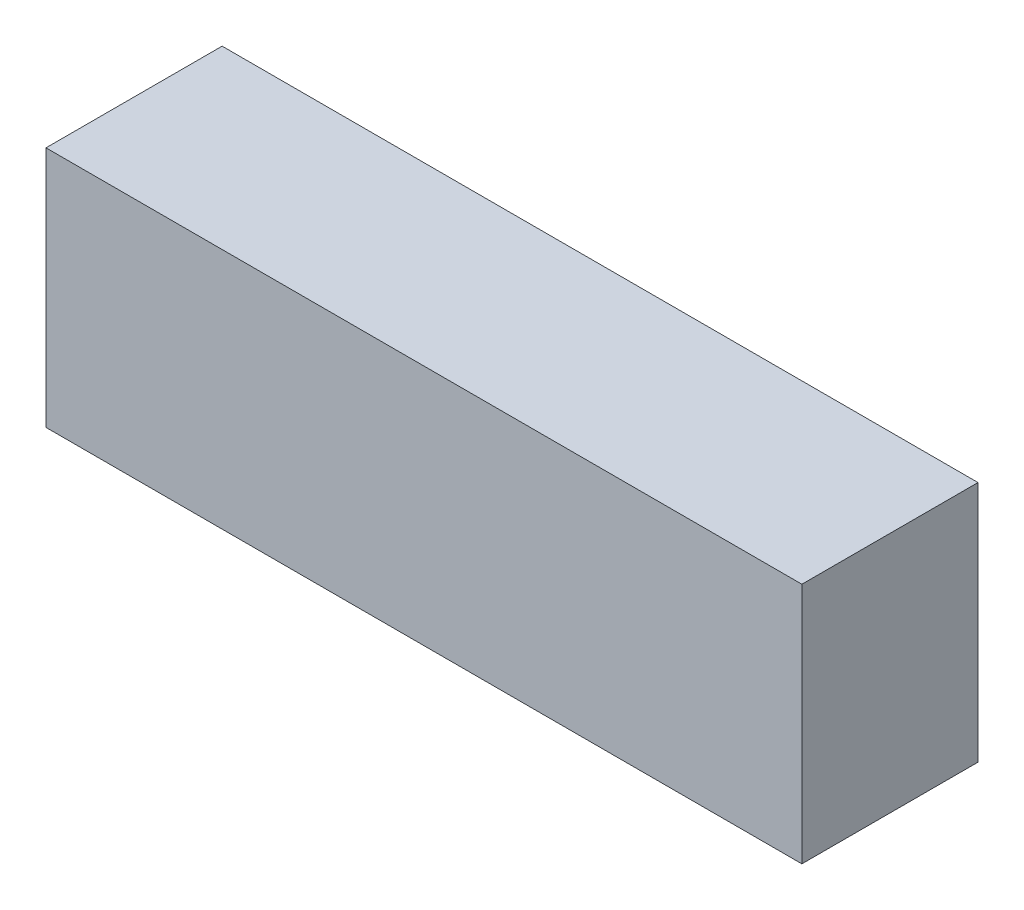
ISO-10303-21;
HEADER;
FILE_DESCRIPTION(('STEP AP214'),'2;1');
FILE_NAME('part.step','',(''),(''),'','','');
FILE_SCHEMA(('AUTOMOTIVE_DESIGN { 1 0 10303 214 1 1 1 1 }'));
ENDSEC;
DATA;
#1=APPLICATION_CONTEXT('core data for automotive mechanical design processes');
#2=APPLICATION_PROTOCOL_DEFINITION('international standard','automotive_design',2000,#1);
#3=PRODUCT_CONTEXT('',#1,'mechanical');
#4=PRODUCT('Part','Part','',(#3));
#5=PRODUCT_RELATED_PRODUCT_CATEGORY('part','',(#4));
#6=PRODUCT_DEFINITION_FORMATION('','',#4);
#7=PRODUCT_DEFINITION_CONTEXT('part definition',#1,'design');
#8=PRODUCT_DEFINITION('design','',#6,#7);
#9=PRODUCT_DEFINITION_SHAPE('','',#8);
#10=(LENGTH_UNIT() NAMED_UNIT(*) SI_UNIT(.MILLI.,.METRE.));
#11=(NAMED_UNIT(*) PLANE_ANGLE_UNIT() SI_UNIT($,.RADIAN.));
#12=(NAMED_UNIT(*) SI_UNIT($,.STERADIAN.) SOLID_ANGLE_UNIT());
#13=UNCERTAINTY_MEASURE_WITH_UNIT(LENGTH_MEASURE(1.E-05),#10,'distance_accuracy_value','');
#14=(GEOMETRIC_REPRESENTATION_CONTEXT(3) GLOBAL_UNCERTAINTY_ASSIGNED_CONTEXT((#13)) GLOBAL_UNIT_ASSIGNED_CONTEXT((#10,
#11,#12)) REPRESENTATION_CONTEXT('',''));
#15=CARTESIAN_POINT('',(0.,0.,0.));
#16=DIRECTION('',(0.,0.,1.));
#17=DIRECTION('',(1.,0.,0.));
#18=AXIS2_PLACEMENT_3D('',#15,#16,#17);
#19=CARTESIAN_POINT('',(-62.6210123290762,20.537027001097,24.));
#20=DIRECTION('',(1.,0.,0.));
#21=DIRECTION('',(0.,0.,-1.));
#22=AXIS2_PLACEMENT_3D('',#19,#20,#21);
#23=PLANE('',#22);
#24=DIRECTION('',(0.,-1.,0.));
#25=VECTOR('',#24,1.);
#26=CARTESIAN_POINT('',(-62.6210123290762,20.537027001097,0.));
#27=LINE('',#26,#25);
#28=CARTESIAN_POINT('',(-62.6210123290762,53.537027001097,0.));
#29=VERTEX_POINT('',#28);
#30=CARTESIAN_POINT('',(-62.6210123290762,20.537027001097,0.));
#31=VERTEX_POINT('',#30);
#32=EDGE_CURVE('E94',#29,#31,#27,.T.);
#33=ORIENTED_EDGE('',*,*,#32,.T.);
#34=DIRECTION('',(0.,0.,-1.));
#35=VECTOR('',#34,1.);
#36=CARTESIAN_POINT('',(-62.6210123290762,20.537027001097,24.));
#37=LINE('',#36,#35);
#38=CARTESIAN_POINT('',(-62.6210123290762,20.537027001097,24.));
#39=VERTEX_POINT('',#38);
#40=EDGE_CURVE('E11',#39,#31,#37,.T.);
#41=ORIENTED_EDGE('',*,*,#40,.F.);
#42=DIRECTION('',(0.,-1.,0.));
#43=VECTOR('',#42,1.);
#44=CARTESIAN_POINT('',(-62.6210123290762,20.537027001097,24.));
#45=LINE('',#44,#43);
#46=CARTESIAN_POINT('',(-62.6210123290762,53.537027001097,24.));
#47=VERTEX_POINT('',#46);
#48=EDGE_CURVE('E82',#47,#39,#45,.T.);
#49=ORIENTED_EDGE('',*,*,#48,.F.);
#50=DIRECTION('',(0.,0.,-1.));
#51=VECTOR('',#50,1.);
#52=CARTESIAN_POINT('',(-62.6210123290762,53.537027001097,24.));
#53=LINE('',#52,#51);
#54=EDGE_CURVE('E90',#47,#29,#53,.T.);
#55=ORIENTED_EDGE('',*,*,#54,.T.);
#56=EDGE_LOOP('',(#33,#41,#49,#55));
#57=FACE_BOUND('',#56,.T.);
#58=ADVANCED_FACE('F31',(#57),#23,.F.);
#59=CARTESIAN_POINT('',(40.3789876709238,20.537027001097,24.));
#60=DIRECTION('',(0.,1.,0.));
#61=DIRECTION('',(-1.,0.,0.));
#62=AXIS2_PLACEMENT_3D('',#59,#60,#61);
#63=PLANE('',#62);
#64=DIRECTION('',(1.,0.,0.));
#65=VECTOR('',#64,1.);
#66=CARTESIAN_POINT('',(40.3789876709238,20.537027001097,0.));
#67=LINE('',#66,#65);
#68=CARTESIAN_POINT('',(40.3789876709238,20.537027001097,0.));
#69=VERTEX_POINT('',#68);
#70=EDGE_CURVE('E86',#31,#69,#67,.T.);
#71=ORIENTED_EDGE('',*,*,#70,.T.);
#72=DIRECTION('',(0.,0.,-1.));
#73=VECTOR('',#72,1.);
#74=CARTESIAN_POINT('',(40.3789876709238,20.537027001097,24.));
#75=LINE('',#74,#73);
#76=CARTESIAN_POINT('',(40.3789876709238,20.537027001097,24.));
#77=VERTEX_POINT('',#76);
#78=EDGE_CURVE('E39',#77,#69,#75,.T.);
#79=ORIENTED_EDGE('',*,*,#78,.F.);
#80=DIRECTION('',(1.,0.,0.));
#81=VECTOR('',#80,1.);
#82=CARTESIAN_POINT('',(40.3789876709238,20.537027001097,24.));
#83=LINE('',#82,#81);
#84=EDGE_CURVE('E77',#39,#77,#83,.T.);
#85=ORIENTED_EDGE('',*,*,#84,.F.);
#86=ORIENTED_EDGE('',*,*,#40,.T.);
#87=EDGE_LOOP('',(#71,#79,#85,#86));
#88=FACE_BOUND('',#87,.T.);
#89=ADVANCED_FACE('F85',(#88),#63,.F.);
#90=CARTESIAN_POINT('',(40.3789876709238,20.537027001097,24.));
#91=DIRECTION('',(-1.,0.,0.));
#92=DIRECTION('',(0.,0.,1.));
#93=AXIS2_PLACEMENT_3D('',#90,#91,#92);
#94=PLANE('',#93);
#95=DIRECTION('',(0.,1.,0.));
#96=VECTOR('',#95,1.);
#97=CARTESIAN_POINT('',(40.3789876709238,20.537027001097,0.));
#98=LINE('',#97,#96);
#99=CARTESIAN_POINT('',(40.3789876709238,53.537027001097,0.));
#100=VERTEX_POINT('',#99);
#101=EDGE_CURVE('E64',#69,#100,#98,.T.);
#102=ORIENTED_EDGE('',*,*,#101,.T.);
#103=DIRECTION('',(0.,0.,-1.));
#104=VECTOR('',#103,1.);
#105=CARTESIAN_POINT('',(40.3789876709238,53.537027001097,24.));
#106=LINE('',#105,#104);
#107=CARTESIAN_POINT('',(40.3789876709238,53.537027001097,24.));
#108=VERTEX_POINT('',#107);
#109=EDGE_CURVE('E87',#108,#100,#106,.T.);
#110=ORIENTED_EDGE('',*,*,#109,.F.);
#111=DIRECTION('',(0.,1.,0.));
#112=VECTOR('',#111,1.);
#113=CARTESIAN_POINT('',(40.3789876709238,20.537027001097,24.));
#114=LINE('',#113,#112);
#115=EDGE_CURVE('E80',#77,#108,#114,.T.);
#116=ORIENTED_EDGE('',*,*,#115,.F.);
#117=ORIENTED_EDGE('',*,*,#78,.T.);
#118=EDGE_LOOP('',(#102,#110,#116,#117));
#119=FACE_BOUND('',#118,.T.);
#120=ADVANCED_FACE('F88',(#119),#94,.F.);
#121=CARTESIAN_POINT('',(40.3789876709238,53.537027001097,24.));
#122=DIRECTION('',(0.,-1.,0.));
#123=DIRECTION('',(1.,0.,0.));
#124=AXIS2_PLACEMENT_3D('',#121,#122,#123);
#125=PLANE('',#124);
#126=DIRECTION('',(-1.,0.,0.));
#127=VECTOR('',#126,1.);
#128=CARTESIAN_POINT('',(40.3789876709238,53.537027001097,0.));
#129=LINE('',#128,#127);
#130=EDGE_CURVE('E70',#100,#29,#129,.T.);
#131=ORIENTED_EDGE('',*,*,#130,.T.);
#132=ORIENTED_EDGE('',*,*,#54,.F.);
#133=DIRECTION('',(-1.,0.,0.));
#134=VECTOR('',#133,1.);
#135=CARTESIAN_POINT('',(40.3789876709238,53.537027001097,24.));
#136=LINE('',#135,#134);
#137=EDGE_CURVE('E47',#108,#47,#136,.T.);
#138=ORIENTED_EDGE('',*,*,#137,.F.);
#139=ORIENTED_EDGE('',*,*,#109,.T.);
#140=EDGE_LOOP('',(#131,#132,#138,#139));
#141=FACE_BOUND('',#140,.T.);
#142=ADVANCED_FACE('F101',(#141),#125,.F.);
#143=CARTESIAN_POINT('',(-62.6210123290762,53.537027001097,24.));
#144=DIRECTION('',(0.,0.,1.));
#145=DIRECTION('',(1.,0.,0.));
#146=AXIS2_PLACEMENT_3D('',#143,#144,#145);
#147=PLANE('',#146);
#148=ORIENTED_EDGE('',*,*,#48,.T.);
#149=ORIENTED_EDGE('',*,*,#84,.T.);
#150=ORIENTED_EDGE('',*,*,#115,.T.);
#151=ORIENTED_EDGE('',*,*,#137,.T.);
#152=EDGE_LOOP('',(#148,#149,#150,#151));
#153=FACE_BOUND('',#152,.T.);
#154=ADVANCED_FACE('F78',(#153),#147,.T.);
#155=CARTESIAN_POINT('',(-62.6210123290762,53.537027001097,0.));
#156=DIRECTION('',(0.,0.,1.));
#157=DIRECTION('',(1.,0.,0.));
#158=AXIS2_PLACEMENT_3D('',#155,#156,#157);
#159=PLANE('',#158);
#160=ORIENTED_EDGE('',*,*,#32,.F.);
#161=ORIENTED_EDGE('',*,*,#130,.F.);
#162=ORIENTED_EDGE('',*,*,#101,.F.);
#163=ORIENTED_EDGE('',*,*,#70,.F.);
#164=EDGE_LOOP('',(#160,#161,#162,#163));
#165=FACE_BOUND('',#164,.T.);
#166=ADVANCED_FACE('F104',(#165),#159,.F.);
#167=CLOSED_SHELL('',(#58,#89,#120,#142,#154,#166));
#168=MANIFOLD_SOLID_BREP('B2',#167);
#169=ADVANCED_BREP_SHAPE_REPRESENTATION('',(#18,#168),#14);
#170=SHAPE_DEFINITION_REPRESENTATION(#9,#169);
ENDSEC;
END-ISO-10303-21;
